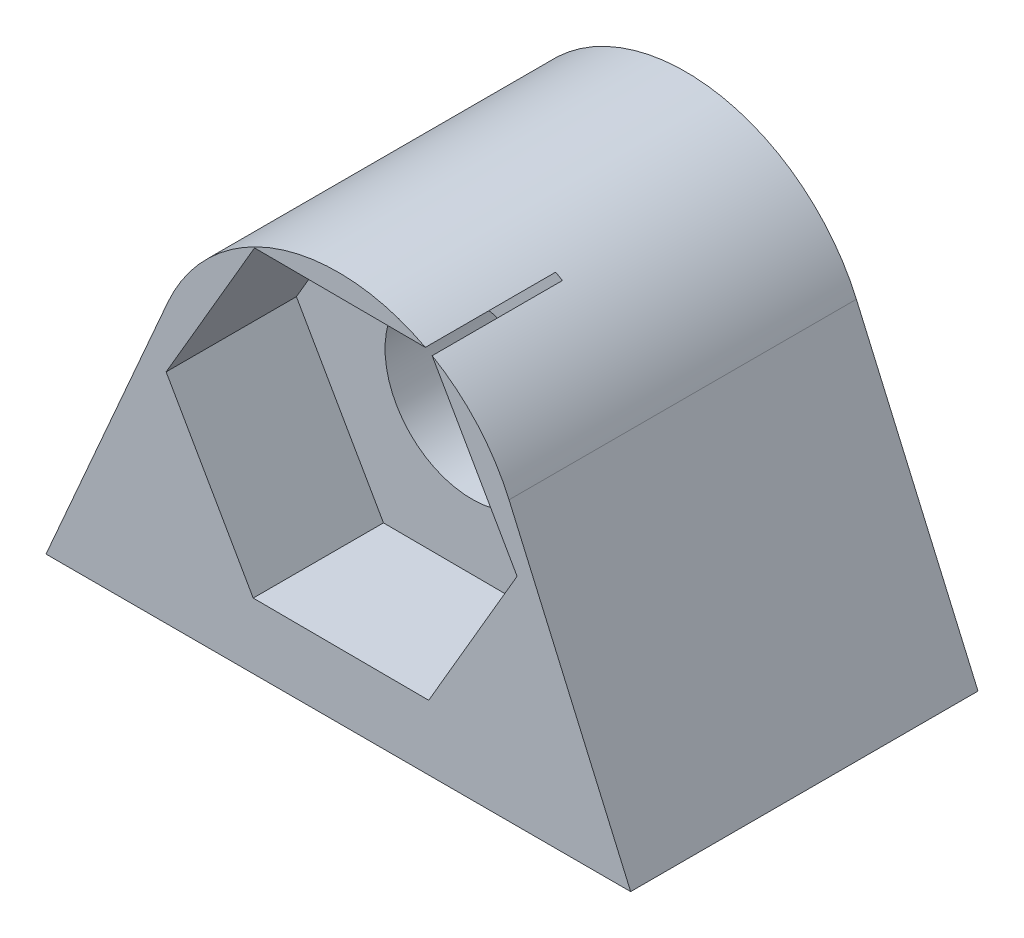
ISO-10303-21;
HEADER;
FILE_DESCRIPTION(('STEP AP214'),'2;1');
FILE_NAME('part.step','',(''),(''),'','','');
FILE_SCHEMA(('AUTOMOTIVE_DESIGN { 1 0 10303 214 1 1 1 1 }'));
ENDSEC;
DATA;
#1=APPLICATION_CONTEXT('core data for automotive mechanical design processes');
#2=APPLICATION_PROTOCOL_DEFINITION('international standard','automotive_design',2000,#1);
#3=PRODUCT_CONTEXT('',#1,'mechanical');
#4=PRODUCT('Part','Part','',(#3));
#5=PRODUCT_RELATED_PRODUCT_CATEGORY('part','',(#4));
#6=PRODUCT_DEFINITION_FORMATION('','',#4);
#7=PRODUCT_DEFINITION_CONTEXT('part definition',#1,'design');
#8=PRODUCT_DEFINITION('design','',#6,#7);
#9=PRODUCT_DEFINITION_SHAPE('','',#8);
#10=(LENGTH_UNIT() NAMED_UNIT(*) SI_UNIT(.MILLI.,.METRE.));
#11=(NAMED_UNIT(*) PLANE_ANGLE_UNIT() SI_UNIT($,.RADIAN.));
#12=(NAMED_UNIT(*) SI_UNIT($,.STERADIAN.) SOLID_ANGLE_UNIT());
#13=UNCERTAINTY_MEASURE_WITH_UNIT(LENGTH_MEASURE(1.E-05),#10,'distance_accuracy_value','');
#14=(GEOMETRIC_REPRESENTATION_CONTEXT(3) GLOBAL_UNCERTAINTY_ASSIGNED_CONTEXT((#13)) GLOBAL_UNIT_ASSIGNED_CONTEXT((#10,
#11,#12)) REPRESENTATION_CONTEXT('',''));
#15=CARTESIAN_POINT('',(0.,0.,0.));
#16=DIRECTION('',(0.,0.,1.));
#17=DIRECTION('',(1.,0.,0.));
#18=AXIS2_PLACEMENT_3D('',#15,#16,#17);
#19=CARTESIAN_POINT('',(0.0757478750343399,5.,8.));
#20=DIRECTION('',(0.,0.,-1.));
#21=DIRECTION('',(-1.,0.,0.));
#22=AXIS2_PLACEMENT_3D('',#19,#20,#21);
#23=CYLINDRICAL_SURFACE('',#22,2.);
#24=CARTESIAN_POINT('',(0.0757478750343399,5.,0.));
#25=DIRECTION('',(0.,0.,1.));
#26=DIRECTION('',(1.,0.,0.));
#27=AXIS2_PLACEMENT_3D('',#24,#25,#26);
#28=CIRCLE('',#27,2.);
#29=CARTESIAN_POINT('',(2.07574787503434,5.,0.));
#30=VERTEX_POINT('',#29);
#31=EDGE_CURVE('E206',#30,#30,#28,.T.);
#32=ORIENTED_EDGE('',*,*,#31,.F.);
#33=EDGE_LOOP('',(#32));
#34=FACE_BOUND('',#33,.T.);
#35=CARTESIAN_POINT('',(0.0757478750343399,5.,5.));
#36=DIRECTION('',(0.,0.,1.));
#37=DIRECTION('',(1.,0.,0.));
#38=AXIS2_PLACEMENT_3D('',#35,#36,#37);
#39=CIRCLE('',#38,2.);
#40=CARTESIAN_POINT('',(2.07574787503434,5.,5.));
#41=VERTEX_POINT('',#40);
#42=EDGE_CURVE('E193',#41,#41,#39,.T.);
#43=ORIENTED_EDGE('',*,*,#42,.T.);
#44=EDGE_LOOP('',(#43));
#45=FACE_BOUND('',#44,.T.);
#46=ADVANCED_FACE('F39',(#34,#45),#23,.F.);
#47=CARTESIAN_POINT('',(0.,4.69826502351145,8.));
#48=DIRECTION('',(0.,0.,-1.));
#49=DIRECTION('',(-1.,0.,0.));
#50=AXIS2_PLACEMENT_3D('',#47,#48,#49);
#51=PLANE('',#50);
#52=DIRECTION('',(-0.503779269310732,-0.863832418824823,0.));
#53=VECTOR('',#52,1.);
#54=CARTESIAN_POINT('',(-1.92966575223208,8.50879602098889,8.));
#55=LINE('',#54,#53);
#56=CARTESIAN_POINT('',(-1.92966575223208,8.50879602098889,8.));
#57=VERTEX_POINT('',#56);
#58=CARTESIAN_POINT('',(-3.96566542947301,5.01765886418623,8.));
#59=VERTEX_POINT('',#58);
#60=EDGE_CURVE('E160',#57,#59,#55,.T.);
#61=ORIENTED_EDGE('',*,*,#60,.F.);
#62=DIRECTION('',(-0.999990453970222,0.00436943571064448,0.));
#63=VECTOR('',#62,1.);
#64=CARTESIAN_POINT('',(2.11174755227527,8.49113715680266,8.));
#65=LINE('',#64,#63);
#66=CARTESIAN_POINT('',(2.00406755285262,8.49160766212892,8.));
#67=VERTEX_POINT('',#66);
#68=EDGE_CURVE('E164',#67,#57,#65,.T.);
#69=ORIENTED_EDGE('',*,*,#68,.F.);
#70=CARTESIAN_POINT('',(0.,4.69826502351145,8.));
#71=DIRECTION('',(0.,0.,1.));
#72=DIRECTION('',(-1.,0.,0.));
#73=AXIS2_PLACEMENT_3D('',#70,#71,#72);
#74=CIRCLE('',#73,4.29019057040011);
#75=CARTESIAN_POINT('',(-3.93170216561451,6.41507986829006,8.));
#76=VERTEX_POINT('',#75);
#77=EDGE_CURVE('E216',#67,#76,#74,.T.);
#78=ORIENTED_EDGE('',*,*,#77,.T.);
#79=DIRECTION('',(-0.400172164058085,-0.916439981184294,0.));
#80=VECTOR('',#79,1.);
#81=CARTESIAN_POINT('',(-6.7329073140211,0.,8.));
#82=LINE('',#81,#80);
#83=CARTESIAN_POINT('',(-6.7329073140211,0.,8.));
#84=VERTEX_POINT('',#83);
#85=EDGE_CURVE('E221',#76,#84,#82,.T.);
#86=ORIENTED_EDGE('',*,*,#85,.T.);
#87=DIRECTION('',(1.,0.,0.));
#88=VECTOR('',#87,1.);
#89=CARTESIAN_POINT('',(6.7329073140211,0.,8.));
#90=LINE('',#89,#88);
#91=CARTESIAN_POINT('',(6.7329073140211,0.,8.));
#92=VERTEX_POINT('',#91);
#93=EDGE_CURVE('E64',#84,#92,#90,.T.);
#94=ORIENTED_EDGE('',*,*,#93,.T.);
#95=DIRECTION('',(-0.400172164058085,0.916439981184294,0.));
#96=VECTOR('',#95,1.);
#97=CARTESIAN_POINT('',(3.93170216561451,6.41507986829006,8.));
#98=LINE('',#97,#96);
#99=CARTESIAN_POINT('',(3.93170216561451,6.41507986829006,8.));
#100=VERTEX_POINT('',#99);
#101=EDGE_CURVE('E94',#92,#100,#98,.T.);
#102=ORIENTED_EDGE('',*,*,#101,.T.);
#103=CARTESIAN_POINT('',(2.16143812070591,8.40419545738488,8.));
#104=VERTEX_POINT('',#103);
#105=EDGE_CURVE('E217',#100,#104,#74,.T.);
#106=ORIENTED_EDGE('',*,*,#105,.T.);
#107=DIRECTION('',(-0.49621118465949,0.868201854535468,0.));
#108=VECTOR('',#107,1.);
#109=CARTESIAN_POINT('',(4.11716117954169,4.98234113581377,8.));
#110=LINE('',#109,#108);
#111=CARTESIAN_POINT('',(4.11716117954169,4.98234113581377,8.));
#112=VERTEX_POINT('',#111);
#113=EDGE_CURVE('E185',#112,#104,#110,.T.);
#114=ORIENTED_EDGE('',*,*,#113,.F.);
#115=DIRECTION('',(0.503779269310732,0.863832418824823,0.));
#116=VECTOR('',#115,1.);
#117=CARTESIAN_POINT('',(2.08116150230076,1.49120397901111,8.));
#118=LINE('',#117,#116);
#119=CARTESIAN_POINT('',(2.08116150230076,1.49120397901111,8.));
#120=VERTEX_POINT('',#119);
#121=EDGE_CURVE('E181',#120,#112,#118,.T.);
#122=ORIENTED_EDGE('',*,*,#121,.F.);
#123=DIRECTION('',(0.999990453970222,-0.00436943571064427,0.));
#124=VECTOR('',#123,1.);
#125=CARTESIAN_POINT('',(-1.96025180220659,1.50886284319734,8.));
#126=LINE('',#125,#124);
#127=CARTESIAN_POINT('',(-1.96025180220659,1.50886284319734,8.));
#128=VERTEX_POINT('',#127);
#129=EDGE_CURVE('E178',#128,#120,#126,.T.);
#130=ORIENTED_EDGE('',*,*,#129,.F.);
#131=DIRECTION('',(0.496211184659489,-0.868201854535468,0.));
#132=VECTOR('',#131,1.);
#133=CARTESIAN_POINT('',(-3.96566542947301,5.01765886418623,8.));
#134=LINE('',#133,#132);
#135=EDGE_CURVE('E142',#59,#128,#134,.T.);
#136=ORIENTED_EDGE('',*,*,#135,.F.);
#137=EDGE_LOOP('',(#61,#69,#78,#86,#94,#102,#106,#114,#122,#130,#136));
#138=FACE_BOUND('',#137,.T.);
#139=ADVANCED_FACE('F259',(#138),#51,.F.);
#140=CARTESIAN_POINT('',(0.,4.69826502351145,0.));
#141=DIRECTION('',(0.,0.,-1.));
#142=DIRECTION('',(-1.,0.,0.));
#143=AXIS2_PLACEMENT_3D('',#140,#141,#142);
#144=PLANE('',#143);
#145=DIRECTION('',(-0.400172164058085,0.916439981184294,0.));
#146=VECTOR('',#145,1.);
#147=CARTESIAN_POINT('',(3.93170216561451,6.41507986829006,0.));
#148=LINE('',#147,#146);
#149=CARTESIAN_POINT('',(6.7329073140211,0.,0.));
#150=VERTEX_POINT('',#149);
#151=CARTESIAN_POINT('',(3.93170216561451,6.41507986829006,0.));
#152=VERTEX_POINT('',#151);
#153=EDGE_CURVE('E210',#150,#152,#148,.T.);
#154=ORIENTED_EDGE('',*,*,#153,.F.);
#155=DIRECTION('',(1.,0.,0.));
#156=VECTOR('',#155,1.);
#157=CARTESIAN_POINT('',(0.,0.,0.));
#158=LINE('',#157,#156);
#159=CARTESIAN_POINT('',(-6.7329073140211,0.,0.));
#160=VERTEX_POINT('',#159);
#161=EDGE_CURVE('E213',#160,#150,#158,.T.);
#162=ORIENTED_EDGE('',*,*,#161,.F.);
#163=DIRECTION('',(-0.400172164058085,-0.916439981184294,0.));
#164=VECTOR('',#163,1.);
#165=CARTESIAN_POINT('',(-6.7329073140211,0.,0.));
#166=LINE('',#165,#164);
#167=CARTESIAN_POINT('',(-3.93170216561451,6.41507986829006,0.));
#168=VERTEX_POINT('',#167);
#169=EDGE_CURVE('E87',#168,#160,#166,.T.);
#170=ORIENTED_EDGE('',*,*,#169,.F.);
#171=CARTESIAN_POINT('',(0.,4.69826502351145,0.));
#172=DIRECTION('',(0.,0.,1.));
#173=DIRECTION('',(-1.,0.,0.));
#174=AXIS2_PLACEMENT_3D('',#171,#172,#173);
#175=CIRCLE('',#174,4.29019057040011);
#176=EDGE_CURVE('E227',#152,#168,#175,.T.);
#177=ORIENTED_EDGE('',*,*,#176,.F.);
#178=EDGE_LOOP('',(#154,#162,#170,#177));
#179=FACE_BOUND('',#178,.T.);
#180=ORIENTED_EDGE('',*,*,#31,.T.);
#181=EDGE_LOOP('',(#180));
#182=FACE_BOUND('',#181,.T.);
#183=ADVANCED_FACE('F265',(#179,#182),#144,.T.);
#184=CARTESIAN_POINT('',(3.93170216561451,6.41507986829006,8.));
#185=DIRECTION('',(-0.916439981184294,-0.400172164058085,0.));
#186=DIRECTION('',(0.400172164058085,-0.916439981184294,0.));
#187=AXIS2_PLACEMENT_3D('',#184,#185,#186);
#188=PLANE('',#187);
#189=ORIENTED_EDGE('',*,*,#153,.T.);
#190=DIRECTION('',(0.,0.,-1.));
#191=VECTOR('',#190,1.);
#192=CARTESIAN_POINT('',(3.93170216561451,6.41507986829006,8.));
#193=LINE('',#192,#191);
#194=EDGE_CURVE('E239',#100,#152,#193,.T.);
#195=ORIENTED_EDGE('',*,*,#194,.F.);
#196=ORIENTED_EDGE('',*,*,#101,.F.);
#197=DIRECTION('',(0.,0.,-1.));
#198=VECTOR('',#197,1.);
#199=CARTESIAN_POINT('',(6.7329073140211,0.,8.));
#200=LINE('',#199,#198);
#201=EDGE_CURVE('E243',#92,#150,#200,.T.);
#202=ORIENTED_EDGE('',*,*,#201,.T.);
#203=EDGE_LOOP('',(#189,#195,#196,#202));
#204=FACE_BOUND('',#203,.T.);
#205=ADVANCED_FACE('F41',(#204),#188,.F.);
#206=CARTESIAN_POINT('',(0.,4.69826502351145,8.));
#207=DIRECTION('',(0.,0.,-1.));
#208=DIRECTION('',(-1.,0.,0.));
#209=AXIS2_PLACEMENT_3D('',#206,#207,#208);
#210=CYLINDRICAL_SURFACE('',#209,4.29019057040011);
#211=ORIENTED_EDGE('',*,*,#77,.F.);
#212=DIRECTION('',(0.,0.,-1.));
#213=VECTOR('',#212,1.);
#214=CARTESIAN_POINT('',(2.00406755285263,8.49160766212891,8.));
#215=LINE('',#214,#213);
#216=CARTESIAN_POINT('',(2.00406755285262,8.49160766212892,5.));
#217=VERTEX_POINT('',#216);
#218=EDGE_CURVE('E11',#67,#217,#215,.T.);
#219=ORIENTED_EDGE('',*,*,#218,.T.);
#220=CARTESIAN_POINT('',(0.,4.69826502351145,5.));
#221=DIRECTION('',(0.,0.,1.));
#222=DIRECTION('',(1.,0.,0.));
#223=AXIS2_PLACEMENT_3D('',#220,#221,#222);
#224=CIRCLE('',#223,4.29019057040011);
#225=CARTESIAN_POINT('',(2.16143812070591,8.40419545738488,5.));
#226=VERTEX_POINT('',#225);
#227=EDGE_CURVE('E203',#226,#217,#224,.T.);
#228=ORIENTED_EDGE('',*,*,#227,.F.);
#229=DIRECTION('',(0.,0.,-1.));
#230=VECTOR('',#229,1.);
#231=CARTESIAN_POINT('',(2.16143812070591,8.40419545738488,8.));
#232=LINE('',#231,#230);
#233=EDGE_CURVE('E48',#226,#104,#232,.F.);
#234=ORIENTED_EDGE('',*,*,#233,.T.);
#235=ORIENTED_EDGE('',*,*,#105,.F.);
#236=ORIENTED_EDGE('',*,*,#194,.T.);
#237=ORIENTED_EDGE('',*,*,#176,.T.);
#238=DIRECTION('',(0.,0.,-1.));
#239=VECTOR('',#238,1.);
#240=CARTESIAN_POINT('',(-3.93170216561451,6.41507986829006,8.));
#241=LINE('',#240,#239);
#242=EDGE_CURVE('E236',#76,#168,#241,.T.);
#243=ORIENTED_EDGE('',*,*,#242,.F.);
#244=EDGE_LOOP('',(#211,#219,#228,#234,#235,#236,#237,#243));
#245=FACE_BOUND('',#244,.T.);
#246=ADVANCED_FACE('F254',(#245),#210,.T.);
#247=CARTESIAN_POINT('',(-6.7329073140211,0.,8.));
#248=DIRECTION('',(0.916439981184294,-0.400172164058085,0.));
#249=DIRECTION('',(0.400172164058085,0.916439981184294,0.));
#250=AXIS2_PLACEMENT_3D('',#247,#248,#249);
#251=PLANE('',#250);
#252=ORIENTED_EDGE('',*,*,#169,.T.);
#253=DIRECTION('',(0.,0.,-1.));
#254=VECTOR('',#253,1.);
#255=CARTESIAN_POINT('',(-6.7329073140211,0.,8.));
#256=LINE('',#255,#254);
#257=EDGE_CURVE('E224',#84,#160,#256,.T.);
#258=ORIENTED_EDGE('',*,*,#257,.F.);
#259=ORIENTED_EDGE('',*,*,#85,.F.);
#260=ORIENTED_EDGE('',*,*,#242,.T.);
#261=EDGE_LOOP('',(#252,#258,#259,#260));
#262=FACE_BOUND('',#261,.T.);
#263=ADVANCED_FACE('F270',(#262),#251,.F.);
#264=CARTESIAN_POINT('',(0.,0.,8.));
#265=DIRECTION('',(0.,1.,0.));
#266=DIRECTION('',(0.,0.,1.));
#267=AXIS2_PLACEMENT_3D('',#264,#265,#266);
#268=PLANE('',#267);
#269=ORIENTED_EDGE('',*,*,#161,.T.);
#270=ORIENTED_EDGE('',*,*,#201,.F.);
#271=ORIENTED_EDGE('',*,*,#93,.F.);
#272=ORIENTED_EDGE('',*,*,#257,.T.);
#273=EDGE_LOOP('',(#269,#270,#271,#272));
#274=FACE_BOUND('',#273,.T.);
#275=ADVANCED_FACE('F268',(#274),#268,.F.);
#276=CARTESIAN_POINT('',(2.11174755227527,8.49113715680266,5.));
#277=DIRECTION('',(0.00436943571064448,0.999990453970222,0.));
#278=DIRECTION('',(-0.999990453970222,0.00436943571064448,0.));
#279=AXIS2_PLACEMENT_3D('',#276,#277,#278);
#280=PLANE('',#279);
#281=ORIENTED_EDGE('',*,*,#68,.T.);
#282=DIRECTION('',(0.,0.,1.));
#283=VECTOR('',#282,1.);
#284=CARTESIAN_POINT('',(-1.92966575223208,8.50879602098889,5.));
#285=LINE('',#284,#283);
#286=CARTESIAN_POINT('',(-1.92966575223208,8.50879602098889,5.));
#287=VERTEX_POINT('',#286);
#288=EDGE_CURVE('E194',#287,#57,#285,.T.);
#289=ORIENTED_EDGE('',*,*,#288,.F.);
#290=DIRECTION('',(-0.999990453970222,0.00436943571064448,0.));
#291=VECTOR('',#290,1.);
#292=CARTESIAN_POINT('',(2.11174755227527,8.49113715680266,5.));
#293=LINE('',#292,#291);
#294=EDGE_CURVE('E171',#217,#287,#293,.T.);
#295=ORIENTED_EDGE('',*,*,#294,.F.);
#296=ORIENTED_EDGE('',*,*,#218,.F.);
#297=EDGE_LOOP('',(#281,#289,#295,#296));
#298=FACE_BOUND('',#297,.T.);
#299=ADVANCED_FACE('F275',(#298),#280,.F.);
#300=CARTESIAN_POINT('',(4.11716117954169,4.98234113581377,5.));
#301=DIRECTION('',(0.868201854535468,0.49621118465949,0.));
#302=DIRECTION('',(-0.49621118465949,0.868201854535468,0.));
#303=AXIS2_PLACEMENT_3D('',#300,#301,#302);
#304=PLANE('',#303);
#305=DIRECTION('',(-0.49621118465949,0.868201854535468,0.));
#306=VECTOR('',#305,1.);
#307=CARTESIAN_POINT('',(4.11716117954169,4.98234113581377,5.));
#308=LINE('',#307,#306);
#309=CARTESIAN_POINT('',(4.11716117954169,4.98234113581377,5.));
#310=VERTEX_POINT('',#309);
#311=EDGE_CURVE('E55',#310,#226,#308,.T.);
#312=ORIENTED_EDGE('',*,*,#311,.F.);
#313=DIRECTION('',(0.,0.,1.));
#314=VECTOR('',#313,1.);
#315=CARTESIAN_POINT('',(4.11716117954169,4.98234113581377,5.));
#316=LINE('',#315,#314);
#317=EDGE_CURVE('E198',#310,#112,#316,.T.);
#318=ORIENTED_EDGE('',*,*,#317,.T.);
#319=ORIENTED_EDGE('',*,*,#113,.T.);
#320=ORIENTED_EDGE('',*,*,#233,.F.);
#321=EDGE_LOOP('',(#312,#318,#319,#320));
#322=FACE_BOUND('',#321,.T.);
#323=ADVANCED_FACE('F281',(#322),#304,.F.);
#324=CARTESIAN_POINT('',(0.,0.,5.));
#325=DIRECTION('',(0.,0.,1.));
#326=DIRECTION('',(1.,0.,0.));
#327=AXIS2_PLACEMENT_3D('',#324,#325,#326);
#328=PLANE('',#327);
#329=ORIENTED_EDGE('',*,*,#42,.F.);
#330=EDGE_LOOP('',(#329));
#331=FACE_BOUND('',#330,.T.);
#332=ORIENTED_EDGE('',*,*,#227,.T.);
#333=ORIENTED_EDGE('',*,*,#294,.T.);
#334=DIRECTION('',(-0.503779269310732,-0.863832418824823,0.));
#335=VECTOR('',#334,1.);
#336=CARTESIAN_POINT('',(-1.92966575223208,8.50879602098889,5.));
#337=LINE('',#336,#335);
#338=CARTESIAN_POINT('',(-3.96566542947301,5.01765886418623,5.));
#339=VERTEX_POINT('',#338);
#340=EDGE_CURVE('E148',#287,#339,#337,.T.);
#341=ORIENTED_EDGE('',*,*,#340,.T.);
#342=DIRECTION('',(0.496211184659489,-0.868201854535468,0.));
#343=VECTOR('',#342,1.);
#344=CARTESIAN_POINT('',(-3.96566542947301,5.01765886418623,5.));
#345=LINE('',#344,#343);
#346=CARTESIAN_POINT('',(-1.96025180220659,1.50886284319734,5.));
#347=VERTEX_POINT('',#346);
#348=EDGE_CURVE('E139',#339,#347,#345,.T.);
#349=ORIENTED_EDGE('',*,*,#348,.T.);
#350=DIRECTION('',(0.999990453970222,-0.00436943571064427,0.));
#351=VECTOR('',#350,1.);
#352=CARTESIAN_POINT('',(-1.96025180220659,1.50886284319734,5.));
#353=LINE('',#352,#351);
#354=CARTESIAN_POINT('',(2.08116150230076,1.49120397901111,5.));
#355=VERTEX_POINT('',#354);
#356=EDGE_CURVE('E151',#347,#355,#353,.T.);
#357=ORIENTED_EDGE('',*,*,#356,.T.);
#358=DIRECTION('',(0.503779269310732,0.863832418824823,0.));
#359=VECTOR('',#358,1.);
#360=CARTESIAN_POINT('',(2.08116150230076,1.49120397901111,5.));
#361=LINE('',#360,#359);
#362=EDGE_CURVE('E155',#355,#310,#361,.T.);
#363=ORIENTED_EDGE('',*,*,#362,.T.);
#364=ORIENTED_EDGE('',*,*,#311,.T.);
#365=EDGE_LOOP('',(#332,#333,#341,#349,#357,#363,#364));
#366=FACE_BOUND('',#365,.T.);
#367=ADVANCED_FACE('F157',(#331,#366),#328,.T.);
#368=CARTESIAN_POINT('',(-3.96566542947301,5.01765886418623,5.));
#369=DIRECTION('',(-0.868201854535468,-0.496211184659489,0.));
#370=DIRECTION('',(0.496211184659489,-0.868201854535468,0.));
#371=AXIS2_PLACEMENT_3D('',#368,#369,#370);
#372=PLANE('',#371);
#373=ORIENTED_EDGE('',*,*,#135,.T.);
#374=DIRECTION('',(0.,0.,1.));
#375=VECTOR('',#374,1.);
#376=CARTESIAN_POINT('',(-1.96025180220659,1.50886284319734,5.));
#377=LINE('',#376,#375);
#378=EDGE_CURVE('E135',#347,#128,#377,.T.);
#379=ORIENTED_EDGE('',*,*,#378,.F.);
#380=ORIENTED_EDGE('',*,*,#348,.F.);
#381=DIRECTION('',(0.,0.,1.));
#382=VECTOR('',#381,1.);
#383=CARTESIAN_POINT('',(-3.96566542947301,5.01765886418623,5.));
#384=LINE('',#383,#382);
#385=EDGE_CURVE('E190',#339,#59,#384,.T.);
#386=ORIENTED_EDGE('',*,*,#385,.T.);
#387=EDGE_LOOP('',(#373,#379,#380,#386));
#388=FACE_BOUND('',#387,.T.);
#389=ADVANCED_FACE('F137',(#388),#372,.F.);
#390=CARTESIAN_POINT('',(-1.92966575223208,8.50879602098889,5.));
#391=DIRECTION('',(-0.863832418824823,0.503779269310732,0.));
#392=DIRECTION('',(-0.503779269310732,-0.863832418824823,0.));
#393=AXIS2_PLACEMENT_3D('',#390,#391,#392);
#394=PLANE('',#393);
#395=ORIENTED_EDGE('',*,*,#60,.T.);
#396=ORIENTED_EDGE('',*,*,#385,.F.);
#397=ORIENTED_EDGE('',*,*,#340,.F.);
#398=ORIENTED_EDGE('',*,*,#288,.T.);
#399=EDGE_LOOP('',(#395,#396,#397,#398));
#400=FACE_BOUND('',#399,.T.);
#401=ADVANCED_FACE('F278',(#400),#394,.F.);
#402=CARTESIAN_POINT('',(2.08116150230076,1.49120397901111,5.));
#403=DIRECTION('',(0.863832418824823,-0.503779269310732,0.));
#404=DIRECTION('',(0.503779269310732,0.863832418824823,0.));
#405=AXIS2_PLACEMENT_3D('',#402,#403,#404);
#406=PLANE('',#405);
#407=ORIENTED_EDGE('',*,*,#121,.T.);
#408=ORIENTED_EDGE('',*,*,#317,.F.);
#409=ORIENTED_EDGE('',*,*,#362,.F.);
#410=DIRECTION('',(0.,0.,1.));
#411=VECTOR('',#410,1.);
#412=CARTESIAN_POINT('',(2.08116150230076,1.49120397901111,5.));
#413=LINE('',#412,#411);
#414=EDGE_CURVE('E147',#355,#120,#413,.T.);
#415=ORIENTED_EDGE('',*,*,#414,.T.);
#416=EDGE_LOOP('',(#407,#408,#409,#415));
#417=FACE_BOUND('',#416,.T.);
#418=ADVANCED_FACE('F280',(#417),#406,.F.);
#419=CARTESIAN_POINT('',(-1.96025180220659,1.50886284319734,5.));
#420=DIRECTION('',(-0.00436943571064427,-0.999990453970222,0.));
#421=DIRECTION('',(0.999990453970222,-0.00436943571064427,0.));
#422=AXIS2_PLACEMENT_3D('',#419,#420,#421);
#423=PLANE('',#422);
#424=ORIENTED_EDGE('',*,*,#129,.T.);
#425=ORIENTED_EDGE('',*,*,#414,.F.);
#426=ORIENTED_EDGE('',*,*,#356,.F.);
#427=ORIENTED_EDGE('',*,*,#378,.T.);
#428=EDGE_LOOP('',(#424,#425,#426,#427));
#429=FACE_BOUND('',#428,.T.);
#430=ADVANCED_FACE('F152',(#429),#423,.F.);
#431=CLOSED_SHELL('',(#46,#139,#183,#205,#246,#263,#275,#299,#323,#367,#389,#401,#418,#430));
#432=MANIFOLD_SOLID_BREP('B2',#431);
#433=ADVANCED_BREP_SHAPE_REPRESENTATION('',(#18,#432),#14);
#434=SHAPE_DEFINITION_REPRESENTATION(#9,#433);
ENDSEC;
END-ISO-10303-21;
